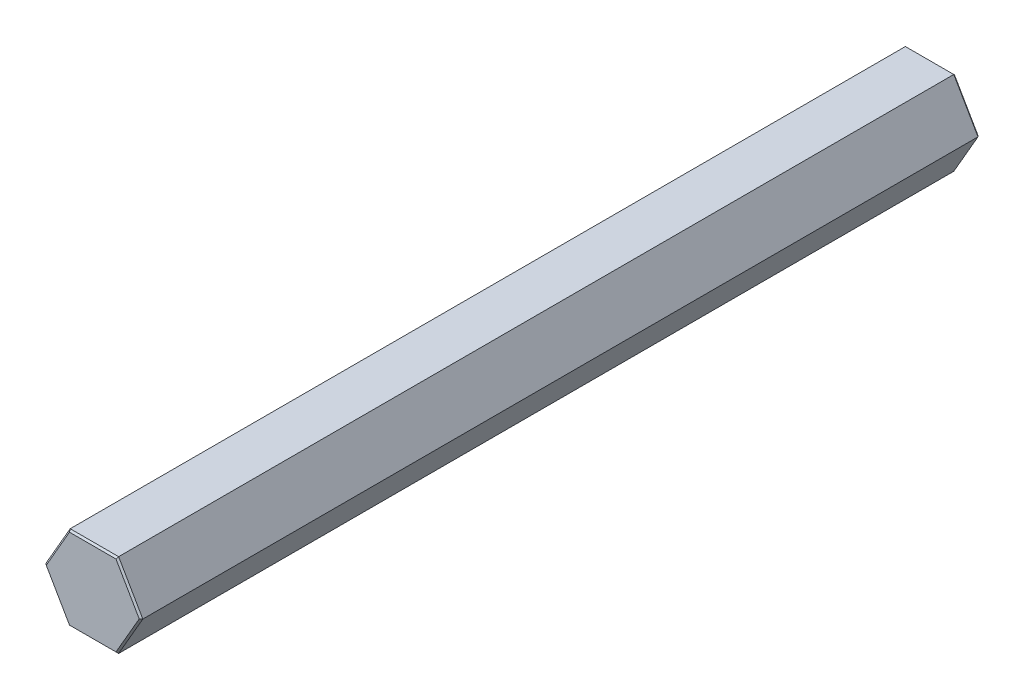
ISO-10303-21;
HEADER;
FILE_DESCRIPTION(('STEP AP214'),'2;1');
FILE_NAME('part.step','',(''),(''),'','','');
FILE_SCHEMA(('AUTOMOTIVE_DESIGN { 1 0 10303 214 1 1 1 1 }'));
ENDSEC;
DATA;
#1=APPLICATION_CONTEXT('core data for automotive mechanical design processes');
#2=APPLICATION_PROTOCOL_DEFINITION('international standard','automotive_design',2000,#1);
#3=PRODUCT_CONTEXT('',#1,'mechanical');
#4=PRODUCT('Part','Part','',(#3));
#5=PRODUCT_RELATED_PRODUCT_CATEGORY('part','',(#4));
#6=PRODUCT_DEFINITION_FORMATION('','',#4);
#7=PRODUCT_DEFINITION_CONTEXT('part definition',#1,'design');
#8=PRODUCT_DEFINITION('design','',#6,#7);
#9=PRODUCT_DEFINITION_SHAPE('','',#8);
#10=(LENGTH_UNIT() NAMED_UNIT(*) SI_UNIT(.MILLI.,.METRE.));
#11=(NAMED_UNIT(*) PLANE_ANGLE_UNIT() SI_UNIT($,.RADIAN.));
#12=(NAMED_UNIT(*) SI_UNIT($,.STERADIAN.) SOLID_ANGLE_UNIT());
#13=UNCERTAINTY_MEASURE_WITH_UNIT(LENGTH_MEASURE(1.E-05),#10,'distance_accuracy_value','');
#14=(GEOMETRIC_REPRESENTATION_CONTEXT(3) GLOBAL_UNCERTAINTY_ASSIGNED_CONTEXT((#13)) GLOBAL_UNIT_ASSIGNED_CONTEXT((#10,
#11,#12)) REPRESENTATION_CONTEXT('',''));
#15=CARTESIAN_POINT('',(0.,0.,0.));
#16=DIRECTION('',(0.,0.,1.));
#17=DIRECTION('',(1.,0.,0.));
#18=AXIS2_PLACEMENT_3D('',#15,#16,#17);
#19=CARTESIAN_POINT('',(-7.33234841870824,0.,127.));
#20=DIRECTION('',(-0.866025403784439,0.5,0.));
#21=DIRECTION('',(-0.5,-0.866025403784439,0.));
#22=AXIS2_PLACEMENT_3D('',#19,#20,#21);
#23=PLANE('',#22);
#24=DIRECTION('',(0.,0.,-1.));
#25=VECTOR('',#24,1.);
#26=CARTESIAN_POINT('',(-3.66617420935412,6.35,127.));
#27=LINE('',#26,#25);
#28=CARTESIAN_POINT('',(-3.66617420935412,6.35,126.746));
#29=VERTEX_POINT('',#28);
#30=CARTESIAN_POINT('',(-3.66617420935412,6.35,0.254000000000032));
#31=VERTEX_POINT('',#30);
#32=EDGE_CURVE('E160',#29,#31,#27,.T.);
#33=ORIENTED_EDGE('',*,*,#32,.T.);
#34=DIRECTION('',(-0.5,-0.866025403784439,0.));
#35=VECTOR('',#34,1.);
#36=CARTESIAN_POINT('',(-7.33234841870824,0.,0.254000000000032));
#37=LINE('',#36,#35);
#38=CARTESIAN_POINT('',(-7.33234841870824,0.,0.254000000000032));
#39=VERTEX_POINT('',#38);
#40=EDGE_CURVE('E157',#31,#39,#37,.T.);
#41=ORIENTED_EDGE('',*,*,#40,.T.);
#42=DIRECTION('',(0.,0.,-1.));
#43=VECTOR('',#42,1.);
#44=CARTESIAN_POINT('',(-7.33234841870824,0.,127.));
#45=LINE('',#44,#43);
#46=CARTESIAN_POINT('',(-7.33234841870824,0.,126.746));
#47=VERTEX_POINT('',#46);
#48=EDGE_CURVE('E154',#47,#39,#45,.T.);
#49=ORIENTED_EDGE('',*,*,#48,.F.);
#50=DIRECTION('',(0.5,0.866025403784439,0.));
#51=VECTOR('',#50,1.);
#52=CARTESIAN_POINT('',(-3.66617420935412,6.35,126.746));
#53=LINE('',#52,#51);
#54=EDGE_CURVE('E214',#47,#29,#53,.T.);
#55=ORIENTED_EDGE('',*,*,#54,.T.);
#56=EDGE_LOOP('',(#33,#41,#49,#55));
#57=FACE_BOUND('',#56,.T.);
#58=ADVANCED_FACE('F39',(#57),#23,.T.);
#59=CARTESIAN_POINT('',(-3.66617420935412,-6.35,127.));
#60=DIRECTION('',(-0.866025403784439,-0.5,0.));
#61=DIRECTION('',(0.5,-0.866025403784439,0.));
#62=AXIS2_PLACEMENT_3D('',#59,#60,#61);
#63=PLANE('',#62);
#64=ORIENTED_EDGE('',*,*,#48,.T.);
#65=DIRECTION('',(0.5,-0.866025403784439,0.));
#66=VECTOR('',#65,1.);
#67=CARTESIAN_POINT('',(-3.66617420935412,-6.35,0.254000000000032));
#68=LINE('',#67,#66);
#69=CARTESIAN_POINT('',(-3.66617420935412,-6.35,0.254000000000032));
#70=VERTEX_POINT('',#69);
#71=EDGE_CURVE('E198',#39,#70,#68,.T.);
#72=ORIENTED_EDGE('',*,*,#71,.T.);
#73=DIRECTION('',(0.,0.,-1.));
#74=VECTOR('',#73,1.);
#75=CARTESIAN_POINT('',(-3.66617420935412,-6.35,127.));
#76=LINE('',#75,#74);
#77=CARTESIAN_POINT('',(-3.66617420935412,-6.35,126.746));
#78=VERTEX_POINT('',#77);
#79=EDGE_CURVE('E277',#78,#70,#76,.T.);
#80=ORIENTED_EDGE('',*,*,#79,.F.);
#81=DIRECTION('',(-0.5,0.866025403784439,0.));
#82=VECTOR('',#81,1.);
#83=CARTESIAN_POINT('',(-7.33234841870824,0.,126.746));
#84=LINE('',#83,#82);
#85=EDGE_CURVE('E204',#78,#47,#84,.T.);
#86=ORIENTED_EDGE('',*,*,#85,.T.);
#87=EDGE_LOOP('',(#64,#72,#80,#86));
#88=FACE_BOUND('',#87,.T.);
#89=ADVANCED_FACE('F280',(#88),#63,.T.);
#90=CARTESIAN_POINT('',(3.66617420935413,-6.35,127.));
#91=DIRECTION('',(0.,-1.,0.));
#92=DIRECTION('',(0.,0.,-1.));
#93=AXIS2_PLACEMENT_3D('',#90,#91,#92);
#94=PLANE('',#93);
#95=ORIENTED_EDGE('',*,*,#79,.T.);
#96=DIRECTION('',(1.,0.,0.));
#97=VECTOR('',#96,1.);
#98=CARTESIAN_POINT('',(3.66617420935413,-6.35,0.254000000000032));
#99=LINE('',#98,#97);
#100=CARTESIAN_POINT('',(3.66617420935413,-6.35,0.254000000000032));
#101=VERTEX_POINT('',#100);
#102=EDGE_CURVE('E237',#70,#101,#99,.T.);
#103=ORIENTED_EDGE('',*,*,#102,.T.);
#104=DIRECTION('',(0.,0.,-1.));
#105=VECTOR('',#104,1.);
#106=CARTESIAN_POINT('',(3.66617420935413,-6.35,127.));
#107=LINE('',#106,#105);
#108=CARTESIAN_POINT('',(3.66617420935413,-6.35,126.746));
#109=VERTEX_POINT('',#108);
#110=EDGE_CURVE('E254',#109,#101,#107,.T.);
#111=ORIENTED_EDGE('',*,*,#110,.F.);
#112=DIRECTION('',(-1.,0.,0.));
#113=VECTOR('',#112,1.);
#114=CARTESIAN_POINT('',(-3.66617420935412,-6.35,126.746));
#115=LINE('',#114,#113);
#116=EDGE_CURVE('E234',#109,#78,#115,.T.);
#117=ORIENTED_EDGE('',*,*,#116,.T.);
#118=EDGE_LOOP('',(#95,#103,#111,#117));
#119=FACE_BOUND('',#118,.T.);
#120=ADVANCED_FACE('F305',(#119),#94,.T.);
#121=CARTESIAN_POINT('',(7.33234841870825,0.,127.));
#122=DIRECTION('',(0.866025403784439,-0.5,0.));
#123=DIRECTION('',(0.5,0.866025403784439,0.));
#124=AXIS2_PLACEMENT_3D('',#121,#122,#123);
#125=PLANE('',#124);
#126=ORIENTED_EDGE('',*,*,#110,.T.);
#127=DIRECTION('',(0.5,0.866025403784439,0.));
#128=VECTOR('',#127,1.);
#129=CARTESIAN_POINT('',(7.33234841870825,0.,0.254000000000032));
#130=LINE('',#129,#128);
#131=CARTESIAN_POINT('',(7.33234841870825,0.,0.254000000000032));
#132=VERTEX_POINT('',#131);
#133=EDGE_CURVE('E209',#101,#132,#130,.T.);
#134=ORIENTED_EDGE('',*,*,#133,.T.);
#135=DIRECTION('',(0.,0.,-1.));
#136=VECTOR('',#135,1.);
#137=CARTESIAN_POINT('',(7.33234841870825,0.,127.));
#138=LINE('',#137,#136);
#139=CARTESIAN_POINT('',(7.33234841870825,0.,126.746));
#140=VERTEX_POINT('',#139);
#141=EDGE_CURVE('E253',#140,#132,#138,.T.);
#142=ORIENTED_EDGE('',*,*,#141,.F.);
#143=DIRECTION('',(-0.5,-0.866025403784439,0.));
#144=VECTOR('',#143,1.);
#145=CARTESIAN_POINT('',(3.66617420935413,-6.35,126.746));
#146=LINE('',#145,#144);
#147=EDGE_CURVE('E241',#140,#109,#146,.T.);
#148=ORIENTED_EDGE('',*,*,#147,.T.);
#149=EDGE_LOOP('',(#126,#134,#142,#148));
#150=FACE_BOUND('',#149,.T.);
#151=ADVANCED_FACE('F252',(#150),#125,.T.);
#152=CARTESIAN_POINT('',(3.66617420935413,6.35,127.));
#153=DIRECTION('',(0.866025403784439,0.5,0.));
#154=DIRECTION('',(-0.5,0.866025403784439,0.));
#155=AXIS2_PLACEMENT_3D('',#152,#153,#154);
#156=PLANE('',#155);
#157=ORIENTED_EDGE('',*,*,#141,.T.);
#158=DIRECTION('',(-0.5,0.866025403784439,0.));
#159=VECTOR('',#158,1.);
#160=CARTESIAN_POINT('',(3.66617420935413,6.35,0.254000000000032));
#161=LINE('',#160,#159);
#162=CARTESIAN_POINT('',(3.66617420935413,6.35,0.254000000000032));
#163=VERTEX_POINT('',#162);
#164=EDGE_CURVE('E206',#132,#163,#161,.T.);
#165=ORIENTED_EDGE('',*,*,#164,.T.);
#166=DIRECTION('',(0.,0.,-1.));
#167=VECTOR('',#166,1.);
#168=CARTESIAN_POINT('',(3.66617420935413,6.35,127.));
#169=LINE('',#168,#167);
#170=CARTESIAN_POINT('',(3.66617420935413,6.35,126.746));
#171=VERTEX_POINT('',#170);
#172=EDGE_CURVE('E263',#171,#163,#169,.T.);
#173=ORIENTED_EDGE('',*,*,#172,.F.);
#174=DIRECTION('',(0.5,-0.866025403784439,0.));
#175=VECTOR('',#174,1.);
#176=CARTESIAN_POINT('',(7.33234841870825,0.,126.746));
#177=LINE('',#176,#175);
#178=EDGE_CURVE('E203',#171,#140,#177,.T.);
#179=ORIENTED_EDGE('',*,*,#178,.T.);
#180=EDGE_LOOP('',(#157,#165,#173,#179));
#181=FACE_BOUND('',#180,.T.);
#182=ADVANCED_FACE('F259',(#181),#156,.T.);
#183=CARTESIAN_POINT('',(-3.66617420935412,6.35,127.));
#184=DIRECTION('',(0.,1.,0.));
#185=DIRECTION('',(0.,0.,1.));
#186=AXIS2_PLACEMENT_3D('',#183,#184,#185);
#187=PLANE('',#186);
#188=ORIENTED_EDGE('',*,*,#172,.T.);
#189=DIRECTION('',(-1.,0.,0.));
#190=VECTOR('',#189,1.);
#191=CARTESIAN_POINT('',(-3.66617420935412,6.35,0.254000000000032));
#192=LINE('',#191,#190);
#193=EDGE_CURVE('E219',#163,#31,#192,.T.);
#194=ORIENTED_EDGE('',*,*,#193,.T.);
#195=ORIENTED_EDGE('',*,*,#32,.F.);
#196=DIRECTION('',(1.,0.,0.));
#197=VECTOR('',#196,1.);
#198=CARTESIAN_POINT('',(3.66617420935413,6.35,126.746));
#199=LINE('',#198,#197);
#200=EDGE_CURVE('E217',#29,#171,#199,.T.);
#201=ORIENTED_EDGE('',*,*,#200,.T.);
#202=EDGE_LOOP('',(#188,#194,#195,#201));
#203=FACE_BOUND('',#202,.T.);
#204=ADVANCED_FACE('F285',(#203),#187,.T.);
#205=CARTESIAN_POINT('',(0.,0.,127.));
#206=DIRECTION('',(0.,0.,-1.));
#207=DIRECTION('',(-1.,0.,0.));
#208=AXIS2_PLACEMENT_3D('',#205,#206,#207);
#209=PLANE('',#208);
#210=DIRECTION('',(-0.5,-0.866025403784439,0.));
#211=VECTOR('',#210,1.);
#212=CARTESIAN_POINT('',(-7.112377966147,-0.126999999999992,127.));
#213=LINE('',#212,#211);
#214=CARTESIAN_POINT('',(-3.51952724097996,6.09600000000001,127.));
#215=VERTEX_POINT('',#214);
#216=CARTESIAN_POINT('',(-7.03905448195993,0.,127.));
#217=VERTEX_POINT('',#216);
#218=EDGE_CURVE('E64',#215,#217,#213,.T.);
#219=ORIENTED_EDGE('',*,*,#218,.T.);
#220=DIRECTION('',(0.5,-0.866025403784439,0.));
#221=VECTOR('',#220,1.);
#222=CARTESIAN_POINT('',(-3.44620375679288,-6.22300000000001,127.));
#223=LINE('',#222,#221);
#224=CARTESIAN_POINT('',(-3.51952724097996,-6.09600000000001,127.));
#225=VERTEX_POINT('',#224);
#226=EDGE_CURVE('E11',#217,#225,#223,.T.);
#227=ORIENTED_EDGE('',*,*,#226,.T.);
#228=DIRECTION('',(1.,0.,0.));
#229=VECTOR('',#228,1.);
#230=CARTESIAN_POINT('',(3.66617420935413,-6.09600000000001,127.));
#231=LINE('',#230,#229);
#232=CARTESIAN_POINT('',(3.51952724097997,-6.09600000000001,127.));
#233=VERTEX_POINT('',#232);
#234=EDGE_CURVE('E49',#225,#233,#231,.T.);
#235=ORIENTED_EDGE('',*,*,#234,.T.);
#236=DIRECTION('',(0.5,0.866025403784439,0.));
#237=VECTOR('',#236,1.);
#238=CARTESIAN_POINT('',(7.11237796614701,0.126999999999997,127.));
#239=LINE('',#238,#237);
#240=CARTESIAN_POINT('',(7.03905448195994,0.,127.));
#241=VERTEX_POINT('',#240);
#242=EDGE_CURVE('E225',#233,#241,#239,.T.);
#243=ORIENTED_EDGE('',*,*,#242,.T.);
#244=DIRECTION('',(-0.5,0.866025403784439,0.));
#245=VECTOR('',#244,1.);
#246=CARTESIAN_POINT('',(3.44620375679289,6.22300000000001,127.));
#247=LINE('',#246,#245);
#248=CARTESIAN_POINT('',(3.51952724097997,6.09600000000001,127.));
#249=VERTEX_POINT('',#248);
#250=EDGE_CURVE('E221',#241,#249,#247,.T.);
#251=ORIENTED_EDGE('',*,*,#250,.T.);
#252=DIRECTION('',(-1.,0.,0.));
#253=VECTOR('',#252,1.);
#254=CARTESIAN_POINT('',(-3.66617420935412,6.09600000000001,127.));
#255=LINE('',#254,#253);
#256=EDGE_CURVE('E223',#249,#215,#255,.T.);
#257=ORIENTED_EDGE('',*,*,#256,.T.);
#258=EDGE_LOOP('',(#219,#227,#235,#243,#251,#257));
#259=FACE_BOUND('',#258,.T.);
#260=ADVANCED_FACE('F227',(#259),#209,.F.);
#261=CARTESIAN_POINT('',(0.,0.,0.));
#262=DIRECTION('',(0.,0.,-1.));
#263=DIRECTION('',(-1.,0.,0.));
#264=AXIS2_PLACEMENT_3D('',#261,#262,#263);
#265=PLANE('',#264);
#266=DIRECTION('',(-0.5,-0.866025403784439,0.));
#267=VECTOR('',#266,1.);
#268=CARTESIAN_POINT('',(5.27929086146992,-3.04799999999999,0.));
#269=LINE('',#268,#267);
#270=CARTESIAN_POINT('',(7.0390544819599,0.,0.));
#271=VERTEX_POINT('',#270);
#272=CARTESIAN_POINT('',(3.51952724097995,-6.09599999999998,0.));
#273=VERTEX_POINT('',#272);
#274=EDGE_CURVE('E243',#271,#273,#269,.T.);
#275=ORIENTED_EDGE('',*,*,#274,.T.);
#276=DIRECTION('',(-1.,0.,0.));
#277=VECTOR('',#276,1.);
#278=CARTESIAN_POINT('',(0.,-6.09599999999998,0.));
#279=LINE('',#278,#277);
#280=CARTESIAN_POINT('',(-3.51952724097994,-6.09599999999998,0.));
#281=VERTEX_POINT('',#280);
#282=EDGE_CURVE('E238',#273,#281,#279,.T.);
#283=ORIENTED_EDGE('',*,*,#282,.T.);
#284=DIRECTION('',(-0.5,0.866025403784439,0.));
#285=VECTOR('',#284,1.);
#286=CARTESIAN_POINT('',(-5.27929086146992,-3.04799999999999,0.));
#287=LINE('',#286,#285);
#288=CARTESIAN_POINT('',(-7.03905448195989,0.,0.));
#289=VERTEX_POINT('',#288);
#290=EDGE_CURVE('E138',#281,#289,#287,.T.);
#291=ORIENTED_EDGE('',*,*,#290,.T.);
#292=DIRECTION('',(0.5,0.866025403784439,0.));
#293=VECTOR('',#292,1.);
#294=CARTESIAN_POINT('',(-5.27929086146992,3.04799999999999,0.));
#295=LINE('',#294,#293);
#296=CARTESIAN_POINT('',(-3.51952724097994,6.09599999999998,0.));
#297=VERTEX_POINT('',#296);
#298=EDGE_CURVE('E131',#289,#297,#295,.T.);
#299=ORIENTED_EDGE('',*,*,#298,.T.);
#300=DIRECTION('',(1.,0.,0.));
#301=VECTOR('',#300,1.);
#302=CARTESIAN_POINT('',(0.,6.09599999999998,0.));
#303=LINE('',#302,#301);
#304=CARTESIAN_POINT('',(3.51952724097995,6.09599999999998,0.));
#305=VERTEX_POINT('',#304);
#306=EDGE_CURVE('E134',#297,#305,#303,.T.);
#307=ORIENTED_EDGE('',*,*,#306,.T.);
#308=DIRECTION('',(0.5,-0.866025403784439,0.));
#309=VECTOR('',#308,1.);
#310=CARTESIAN_POINT('',(5.27929086146993,3.04799999999999,0.));
#311=LINE('',#310,#309);
#312=EDGE_CURVE('E143',#305,#271,#311,.T.);
#313=ORIENTED_EDGE('',*,*,#312,.T.);
#314=EDGE_LOOP('',(#275,#283,#291,#299,#307,#313));
#315=FACE_BOUND('',#314,.T.);
#316=ADVANCED_FACE('F133',(#315),#265,.T.);
#317=CARTESIAN_POINT('',(0.,6.09599999999998,0.));
#318=DIRECTION('',(0.,-0.707106781186567,0.707106781186528));
#319=DIRECTION('',(1.,0.,0.));
#320=AXIS2_PLACEMENT_3D('',#317,#318,#319);
#321=PLANE('',#320);
#322=DIRECTION('',(-0.377964473009221,0.654653670707961,0.654653670707997));
#323=VECTOR('',#322,1.);
#324=CARTESIAN_POINT('',(-3.01673763512568,5.22514285714288,-0.87085714285715));
#325=LINE('',#324,#323);
#326=EDGE_CURVE('E149',#31,#297,#325,.F.);
#327=ORIENTED_EDGE('',*,*,#326,.F.);
#328=ORIENTED_EDGE('',*,*,#193,.F.);
#329=DIRECTION('',(-0.377964473009218,-0.654653670707962,-0.654653670707998));
#330=VECTOR('',#329,1.);
#331=CARTESIAN_POINT('',(3.0167376351257,5.22514285714288,-0.870857142857147));
#332=LINE('',#331,#330);
#333=EDGE_CURVE('E152',#305,#163,#332,.F.);
#334=ORIENTED_EDGE('',*,*,#333,.F.);
#335=ORIENTED_EDGE('',*,*,#306,.F.);
#336=EDGE_LOOP('',(#327,#328,#334,#335));
#337=FACE_BOUND('',#336,.T.);
#338=ADVANCED_FACE('F147',(#337),#321,.F.);
#339=CARTESIAN_POINT('',(5.27929086146993,3.04799999999999,0.));
#340=DIRECTION('',(-0.612372435695812,-0.353553390593283,0.707106781186528));
#341=DIRECTION('',(0.5,-0.866025403784439,0.));
#342=AXIS2_PLACEMENT_3D('',#339,#340,#341);
#343=PLANE('',#342);
#344=ORIENTED_EDGE('',*,*,#333,.T.);
#345=ORIENTED_EDGE('',*,*,#164,.F.);
#346=DIRECTION('',(-0.755928946018437,0.,-0.654653670707997));
#347=VECTOR('',#346,1.);
#348=CARTESIAN_POINT('',(6.03347527025138,0.,-0.87085714285715));
#349=LINE('',#348,#347);
#350=EDGE_CURVE('E158',#271,#132,#349,.F.);
#351=ORIENTED_EDGE('',*,*,#350,.F.);
#352=ORIENTED_EDGE('',*,*,#312,.F.);
#353=EDGE_LOOP('',(#344,#345,#351,#352));
#354=FACE_BOUND('',#353,.T.);
#355=ADVANCED_FACE('F267',(#354),#343,.F.);
#356=CARTESIAN_POINT('',(-5.27929086146992,3.04799999999999,0.));
#357=DIRECTION('',(0.61237243569581,-0.353553390593283,0.707106781186529));
#358=DIRECTION('',(0.5,0.866025403784439,0.));
#359=AXIS2_PLACEMENT_3D('',#356,#357,#358);
#360=PLANE('',#359);
#361=ORIENTED_EDGE('',*,*,#326,.T.);
#362=ORIENTED_EDGE('',*,*,#298,.F.);
#363=DIRECTION('',(-0.755928946018437,0.,0.654653670707997));
#364=VECTOR('',#363,1.);
#365=CARTESIAN_POINT('',(-6.03347527025139,0.,-0.870857142857141));
#366=LINE('',#365,#364);
#367=EDGE_CURVE('E163',#39,#289,#366,.F.);
#368=ORIENTED_EDGE('',*,*,#367,.F.);
#369=ORIENTED_EDGE('',*,*,#40,.F.);
#370=EDGE_LOOP('',(#361,#362,#368,#369));
#371=FACE_BOUND('',#370,.T.);
#372=ADVANCED_FACE('F156',(#371),#360,.F.);
#373=CARTESIAN_POINT('',(5.27929086146992,-3.04799999999999,0.));
#374=DIRECTION('',(-0.612372435695811,0.353553390593283,0.707106781186529));
#375=DIRECTION('',(-0.5,-0.866025403784439,0.));
#376=AXIS2_PLACEMENT_3D('',#373,#374,#375);
#377=PLANE('',#376);
#378=ORIENTED_EDGE('',*,*,#350,.T.);
#379=ORIENTED_EDGE('',*,*,#133,.F.);
#380=DIRECTION('',(-0.37796447300922,0.654653670707961,-0.654653670707997));
#381=VECTOR('',#380,1.);
#382=CARTESIAN_POINT('',(3.0167376351257,-5.22514285714288,-0.870857142857144));
#383=LINE('',#382,#381);
#384=EDGE_CURVE('E187',#273,#101,#383,.F.);
#385=ORIENTED_EDGE('',*,*,#384,.F.);
#386=ORIENTED_EDGE('',*,*,#274,.F.);
#387=EDGE_LOOP('',(#378,#379,#385,#386));
#388=FACE_BOUND('',#387,.T.);
#389=ADVANCED_FACE('F269',(#388),#377,.F.);
#390=CARTESIAN_POINT('',(-5.27929086146992,-3.04799999999999,0.));
#391=DIRECTION('',(0.612372435695811,0.353553390593283,0.707106781186528));
#392=DIRECTION('',(-0.5,0.866025403784439,0.));
#393=AXIS2_PLACEMENT_3D('',#390,#391,#392);
#394=PLANE('',#393);
#395=ORIENTED_EDGE('',*,*,#367,.T.);
#396=ORIENTED_EDGE('',*,*,#290,.F.);
#397=DIRECTION('',(-0.377964473009218,-0.654653670707962,0.654653670707998));
#398=VECTOR('',#397,1.);
#399=CARTESIAN_POINT('',(-3.01673763512569,-5.22514285714288,-0.870857142857148));
#400=LINE('',#399,#398);
#401=EDGE_CURVE('E182',#70,#281,#400,.F.);
#402=ORIENTED_EDGE('',*,*,#401,.F.);
#403=ORIENTED_EDGE('',*,*,#71,.F.);
#404=EDGE_LOOP('',(#395,#396,#402,#403));
#405=FACE_BOUND('',#404,.T.);
#406=ADVANCED_FACE('F197',(#405),#394,.F.);
#407=CARTESIAN_POINT('',(0.,-6.09599999999998,0.));
#408=DIRECTION('',(0.,0.707106781186567,0.707106781186528));
#409=DIRECTION('',(-1.,0.,0.));
#410=AXIS2_PLACEMENT_3D('',#407,#408,#409);
#411=PLANE('',#410);
#412=ORIENTED_EDGE('',*,*,#384,.T.);
#413=ORIENTED_EDGE('',*,*,#102,.F.);
#414=ORIENTED_EDGE('',*,*,#401,.T.);
#415=ORIENTED_EDGE('',*,*,#282,.F.);
#416=EDGE_LOOP('',(#412,#413,#414,#415));
#417=FACE_BOUND('',#416,.T.);
#418=ADVANCED_FACE('F311',(#417),#411,.F.);
#419=CARTESIAN_POINT('',(3.66617420935413,6.35,126.746));
#420=DIRECTION('',(0.612372435695818,0.353553390593287,0.707106781186521));
#421=DIRECTION('',(-0.5,0.866025403784439,0.));
#422=AXIS2_PLACEMENT_3D('',#419,#420,#421);
#423=PLANE('',#422);
#424=DIRECTION('',(-0.377964473009213,-0.654653670707958,0.654653670708005));
#425=VECTOR('',#424,1.);
#426=CARTESIAN_POINT('',(3.66617420935413,6.35,126.746));
#427=LINE('',#426,#425);
#428=EDGE_CURVE('E175',#249,#171,#427,.F.);
#429=ORIENTED_EDGE('',*,*,#428,.F.);
#430=ORIENTED_EDGE('',*,*,#250,.F.);
#431=DIRECTION('',(0.755928946018431,0.,-0.654653670708004));
#432=VECTOR('',#431,1.);
#433=CARTESIAN_POINT('',(5.23739172764886,0.,128.560285714286));
#434=LINE('',#433,#432);
#435=EDGE_CURVE('E44',#140,#241,#434,.F.);
#436=ORIENTED_EDGE('',*,*,#435,.F.);
#437=ORIENTED_EDGE('',*,*,#178,.F.);
#438=EDGE_LOOP('',(#429,#430,#436,#437));
#439=FACE_BOUND('',#438,.T.);
#440=ADVANCED_FACE('F42',(#439),#423,.T.);
#441=CARTESIAN_POINT('',(7.33234841870825,0.,126.746));
#442=DIRECTION('',(0.612372435695816,-0.353553390593286,0.707106781186523));
#443=DIRECTION('',(0.5,0.866025403784439,0.));
#444=AXIS2_PLACEMENT_3D('',#441,#442,#443);
#445=PLANE('',#444);
#446=ORIENTED_EDGE('',*,*,#435,.T.);
#447=ORIENTED_EDGE('',*,*,#242,.F.);
#448=DIRECTION('',(0.377964473009217,-0.654653670707956,-0.654653670708004));
#449=VECTOR('',#448,1.);
#450=CARTESIAN_POINT('',(2.61869586382444,-4.5357142857144,128.560285714286));
#451=LINE('',#450,#449);
#452=EDGE_CURVE('E173',#109,#233,#451,.F.);
#453=ORIENTED_EDGE('',*,*,#452,.F.);
#454=ORIENTED_EDGE('',*,*,#147,.F.);
#455=EDGE_LOOP('',(#446,#447,#453,#454));
#456=FACE_BOUND('',#455,.T.);
#457=ADVANCED_FACE('F231',(#456),#445,.T.);
#458=CARTESIAN_POINT('',(-3.66617420935412,6.35,126.746));
#459=DIRECTION('',(0.,0.707106781186573,0.707106781186522));
#460=DIRECTION('',(-1.,0.,0.));
#461=AXIS2_PLACEMENT_3D('',#458,#459,#460);
#462=PLANE('',#461);
#463=ORIENTED_EDGE('',*,*,#428,.T.);
#464=ORIENTED_EDGE('',*,*,#200,.F.);
#465=DIRECTION('',(0.377964473009221,-0.654653670707956,0.654653670708003));
#466=VECTOR('',#465,1.);
#467=CARTESIAN_POINT('',(-3.66617420935412,6.35,126.746));
#468=LINE('',#467,#466);
#469=EDGE_CURVE('E170',#215,#29,#468,.F.);
#470=ORIENTED_EDGE('',*,*,#469,.F.);
#471=ORIENTED_EDGE('',*,*,#256,.F.);
#472=EDGE_LOOP('',(#463,#464,#470,#471));
#473=FACE_BOUND('',#472,.T.);
#474=ADVANCED_FACE('F287',(#473),#462,.T.);
#475=CARTESIAN_POINT('',(3.66617420935413,-6.35,126.746));
#476=DIRECTION('',(0.,-0.707106781186573,0.707106781186522));
#477=DIRECTION('',(1.,0.,0.));
#478=AXIS2_PLACEMENT_3D('',#475,#476,#477);
#479=PLANE('',#478);
#480=ORIENTED_EDGE('',*,*,#452,.T.);
#481=ORIENTED_EDGE('',*,*,#234,.F.);
#482=DIRECTION('',(-0.377964473009216,-0.654653670707957,-0.654653670708004));
#483=VECTOR('',#482,1.);
#484=CARTESIAN_POINT('',(-2.61869586382443,-4.5357142857144,128.560285714286));
#485=LINE('',#484,#483);
#486=EDGE_CURVE('E57',#78,#225,#485,.F.);
#487=ORIENTED_EDGE('',*,*,#486,.F.);
#488=ORIENTED_EDGE('',*,*,#116,.F.);
#489=EDGE_LOOP('',(#480,#481,#487,#488));
#490=FACE_BOUND('',#489,.T.);
#491=ADVANCED_FACE('F233',(#490),#479,.T.);
#492=CARTESIAN_POINT('',(-7.33234841870824,0.,126.746));
#493=DIRECTION('',(-0.612372435695814,0.353553390593285,0.707106781186525));
#494=DIRECTION('',(-0.5,-0.866025403784439,0.));
#495=AXIS2_PLACEMENT_3D('',#492,#493,#494);
#496=PLANE('',#495);
#497=ORIENTED_EDGE('',*,*,#469,.T.);
#498=ORIENTED_EDGE('',*,*,#54,.F.);
#499=DIRECTION('',(0.755928946018432,0.,0.654653670708003));
#500=VECTOR('',#499,1.);
#501=CARTESIAN_POINT('',(-7.33234841870824,0.,126.746));
#502=LINE('',#501,#500);
#503=EDGE_CURVE('E167',#217,#47,#502,.F.);
#504=ORIENTED_EDGE('',*,*,#503,.F.);
#505=ORIENTED_EDGE('',*,*,#218,.F.);
#506=EDGE_LOOP('',(#497,#498,#504,#505));
#507=FACE_BOUND('',#506,.T.);
#508=ADVANCED_FACE('F289',(#507),#496,.T.);
#509=CARTESIAN_POINT('',(-3.66617420935412,-6.35,126.746));
#510=DIRECTION('',(-0.612372435695817,-0.353553390593286,0.707106781186522));
#511=DIRECTION('',(0.5,-0.866025403784439,0.));
#512=AXIS2_PLACEMENT_3D('',#509,#510,#511);
#513=PLANE('',#512);
#514=ORIENTED_EDGE('',*,*,#486,.T.);
#515=ORIENTED_EDGE('',*,*,#226,.F.);
#516=ORIENTED_EDGE('',*,*,#503,.T.);
#517=ORIENTED_EDGE('',*,*,#85,.F.);
#518=EDGE_LOOP('',(#514,#515,#516,#517));
#519=FACE_BOUND('',#518,.T.);
#520=ADVANCED_FACE('F291',(#519),#513,.T.);
#521=CLOSED_SHELL('',(#58,#89,#120,#151,#182,#204,#260,#316,#338,#355,#372,#389,#406,#418,#440,
#457,#474,#491,#508,#520));
#522=MANIFOLD_SOLID_BREP('B2',#521);
#523=ADVANCED_BREP_SHAPE_REPRESENTATION('',(#18,#522),#14);
#524=SHAPE_DEFINITION_REPRESENTATION(#9,#523);
ENDSEC;
END-ISO-10303-21;
